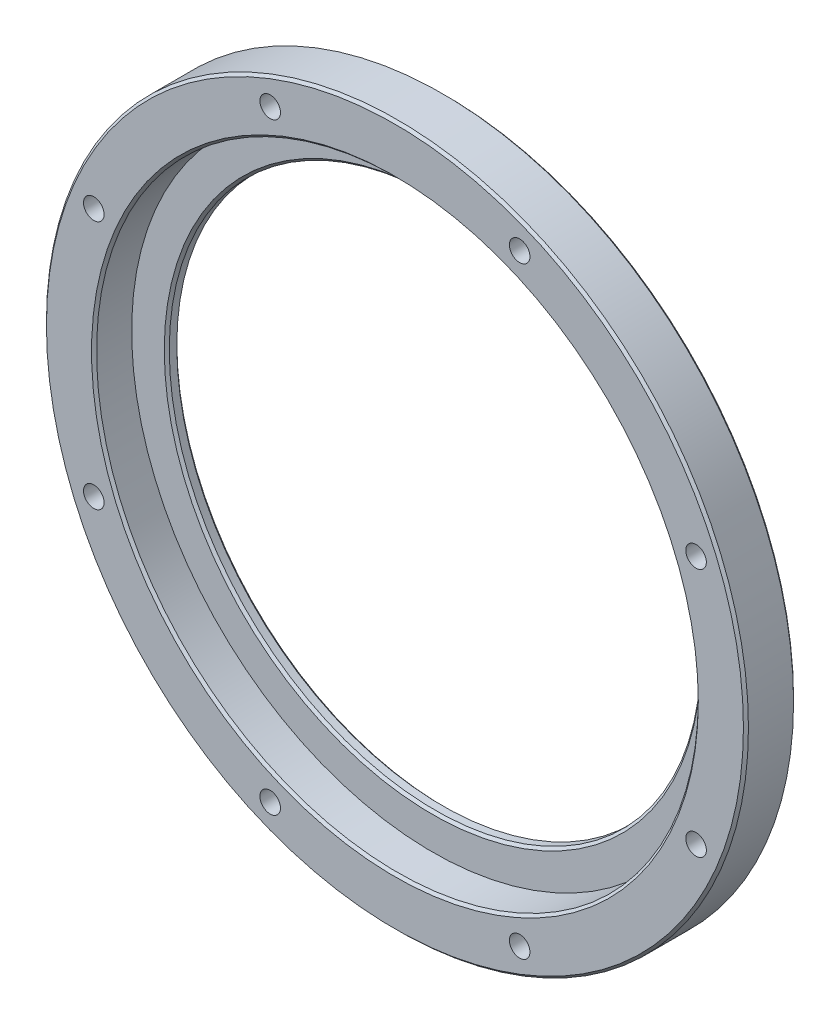
ISO-10303-21;
HEADER;
FILE_DESCRIPTION(('STEP AP214'),'2;1');
FILE_NAME('part.step','',(''),(''),'','','');
FILE_SCHEMA(('AUTOMOTIVE_DESIGN { 1 0 10303 214 1 1 1 1 }'));
ENDSEC;
DATA;
#1=APPLICATION_CONTEXT('core data for automotive mechanical design processes');
#2=APPLICATION_PROTOCOL_DEFINITION('international standard','automotive_design',2000,#1);
#3=PRODUCT_CONTEXT('',#1,'mechanical');
#4=PRODUCT('Part','Part','',(#3));
#5=PRODUCT_RELATED_PRODUCT_CATEGORY('part','',(#4));
#6=PRODUCT_DEFINITION_FORMATION('','',#4);
#7=PRODUCT_DEFINITION_CONTEXT('part definition',#1,'design');
#8=PRODUCT_DEFINITION('design','',#6,#7);
#9=PRODUCT_DEFINITION_SHAPE('','',#8);
#10=(LENGTH_UNIT() NAMED_UNIT(*) SI_UNIT(.MILLI.,.METRE.));
#11=(NAMED_UNIT(*) PLANE_ANGLE_UNIT() SI_UNIT($,.RADIAN.));
#12=(NAMED_UNIT(*) SI_UNIT($,.STERADIAN.) SOLID_ANGLE_UNIT());
#13=UNCERTAINTY_MEASURE_WITH_UNIT(LENGTH_MEASURE(1.E-05),#10,'distance_accuracy_value','');
#14=(GEOMETRIC_REPRESENTATION_CONTEXT(3) GLOBAL_UNCERTAINTY_ASSIGNED_CONTEXT((#13)) GLOBAL_UNIT_ASSIGNED_CONTEXT((#10,
#11,#12)) REPRESENTATION_CONTEXT('',''));
#15=CARTESIAN_POINT('',(0.,0.,0.));
#16=DIRECTION('',(0.,0.,1.));
#17=DIRECTION('',(1.,0.,0.));
#18=AXIS2_PLACEMENT_3D('',#15,#16,#17);
#19=CARTESIAN_POINT('',(0.,0.,20.));
#20=DIRECTION('',(0.,0.,-1.));
#21=DIRECTION('',(-1.,0.,0.));
#22=AXIS2_PLACEMENT_3D('',#19,#20,#21);
#23=CYLINDRICAL_SURFACE('',#22,140.);
#24=CARTESIAN_POINT('',(0.,0.,1.));
#25=DIRECTION('',(0.,0.,-1.));
#26=DIRECTION('',(-1.,0.,0.));
#27=AXIS2_PLACEMENT_3D('',#24,#25,#26);
#28=CIRCLE('',#27,140.);
#29=CARTESIAN_POINT('',(-140.,0.,1.));
#30=VERTEX_POINT('',#29);
#31=EDGE_CURVE('E76',#30,#30,#28,.F.);
#32=ORIENTED_EDGE('',*,*,#31,.T.);
#33=EDGE_LOOP('',(#32));
#34=FACE_BOUND('',#33,.T.);
#35=CARTESIAN_POINT('',(0.,0.,19.0000000000001));
#36=DIRECTION('',(0.,0.,1.));
#37=DIRECTION('',(1.,0.,0.));
#38=AXIS2_PLACEMENT_3D('',#35,#36,#37);
#39=CIRCLE('',#38,140.);
#40=CARTESIAN_POINT('',(140.,0.,19.0000000000001));
#41=VERTEX_POINT('',#40);
#42=EDGE_CURVE('E79',#41,#41,#39,.F.);
#43=ORIENTED_EDGE('',*,*,#42,.T.);
#44=EDGE_LOOP('',(#43));
#45=FACE_BOUND('',#44,.T.);
#46=ADVANCED_FACE('F49',(#34,#45),#23,.T.);
#47=CARTESIAN_POINT('',(140.,0.,20.));
#48=DIRECTION('',(0.,0.,1.));
#49=DIRECTION('',(1.,0.,0.));
#50=AXIS2_PLACEMENT_3D('',#47,#48,#49);
#51=PLANE('',#50);
#52=CARTESIAN_POINT('',(0.,0.,20.));
#53=DIRECTION('',(0.,0.,1.));
#54=DIRECTION('',(1.,0.,0.));
#55=AXIS2_PLACEMENT_3D('',#52,#53,#54);
#56=CIRCLE('',#55,121.);
#57=CARTESIAN_POINT('',(121.,0.,20.));
#58=VERTEX_POINT('',#57);
#59=EDGE_CURVE('E10',#58,#58,#56,.F.);
#60=ORIENTED_EDGE('',*,*,#59,.T.);
#61=EDGE_LOOP('',(#60));
#62=FACE_BOUND('',#61,.T.);
#63=CARTESIAN_POINT('',(0.,0.,20.));
#64=DIRECTION('',(0.,0.,1.));
#65=DIRECTION('',(1.,0.,0.));
#66=AXIS2_PLACEMENT_3D('',#63,#64,#65);
#67=CIRCLE('',#66,139.);
#68=CARTESIAN_POINT('',(139.,0.,20.));
#69=VERTEX_POINT('',#68);
#70=EDGE_CURVE('E57',#69,#69,#67,.T.);
#71=ORIENTED_EDGE('',*,*,#70,.T.);
#72=EDGE_LOOP('',(#71));
#73=FACE_BOUND('',#72,.T.);
#74=CARTESIAN_POINT('',(49.7488462074617,120.104339226467,20.));
#75=DIRECTION('',(0.,0.,1.));
#76=DIRECTION('',(1.,0.,0.));
#77=AXIS2_PLACEMENT_3D('',#74,#75,#76);
#78=CIRCLE('',#77,4.09999999999999);
#79=CARTESIAN_POINT('',(53.8488462074617,120.104339226467,20.));
#80=VERTEX_POINT('',#79);
#81=EDGE_CURVE('E133',#80,#80,#78,.T.);
#82=ORIENTED_EDGE('',*,*,#81,.F.);
#83=EDGE_LOOP('',(#82));
#84=FACE_BOUND('',#83,.T.);
#85=CARTESIAN_POINT('',(120.104339226467,49.7488462074616,20.));
#86=DIRECTION('',(0.,0.,1.));
#87=DIRECTION('',(1.,0.,0.));
#88=AXIS2_PLACEMENT_3D('',#85,#86,#87);
#89=CIRCLE('',#88,4.09999999999999);
#90=CARTESIAN_POINT('',(124.204339226467,49.7488462074616,20.));
#91=VERTEX_POINT('',#90);
#92=EDGE_CURVE('E127',#91,#91,#89,.T.);
#93=ORIENTED_EDGE('',*,*,#92,.F.);
#94=EDGE_LOOP('',(#93));
#95=FACE_BOUND('',#94,.T.);
#96=CARTESIAN_POINT('',(120.104339226467,-49.7488462074617,20.));
#97=DIRECTION('',(0.,0.,1.));
#98=DIRECTION('',(1.,0.,0.));
#99=AXIS2_PLACEMENT_3D('',#96,#97,#98);
#100=CIRCLE('',#99,4.09999999999999);
#101=CARTESIAN_POINT('',(124.204339226467,-49.7488462074617,20.));
#102=VERTEX_POINT('',#101);
#103=EDGE_CURVE('E121',#102,#102,#100,.T.);
#104=ORIENTED_EDGE('',*,*,#103,.F.);
#105=EDGE_LOOP('',(#104));
#106=FACE_BOUND('',#105,.T.);
#107=CARTESIAN_POINT('',(49.7488462074616,-120.104339226467,20.));
#108=DIRECTION('',(0.,0.,1.));
#109=DIRECTION('',(1.,0.,0.));
#110=AXIS2_PLACEMENT_3D('',#107,#108,#109);
#111=CIRCLE('',#110,4.09999999999999);
#112=CARTESIAN_POINT('',(53.8488462074616,-120.104339226467,20.));
#113=VERTEX_POINT('',#112);
#114=EDGE_CURVE('E115',#113,#113,#111,.T.);
#115=ORIENTED_EDGE('',*,*,#114,.F.);
#116=EDGE_LOOP('',(#115));
#117=FACE_BOUND('',#116,.T.);
#118=CARTESIAN_POINT('',(-49.7488462074617,-120.104339226467,20.));
#119=DIRECTION('',(0.,0.,1.));
#120=DIRECTION('',(1.,0.,0.));
#121=AXIS2_PLACEMENT_3D('',#118,#119,#120);
#122=CIRCLE('',#121,4.09999999999999);
#123=CARTESIAN_POINT('',(-45.6488462074617,-120.104339226467,20.));
#124=VERTEX_POINT('',#123);
#125=EDGE_CURVE('E109',#124,#124,#122,.T.);
#126=ORIENTED_EDGE('',*,*,#125,.F.);
#127=EDGE_LOOP('',(#126));
#128=FACE_BOUND('',#127,.T.);
#129=CARTESIAN_POINT('',(-120.104339226467,-49.7488462074617,20.));
#130=DIRECTION('',(0.,0.,1.));
#131=DIRECTION('',(1.,0.,0.));
#132=AXIS2_PLACEMENT_3D('',#129,#130,#131);
#133=CIRCLE('',#132,4.09999999999999);
#134=CARTESIAN_POINT('',(-116.004339226467,-49.7488462074617,20.));
#135=VERTEX_POINT('',#134);
#136=EDGE_CURVE('E103',#135,#135,#133,.T.);
#137=ORIENTED_EDGE('',*,*,#136,.F.);
#138=EDGE_LOOP('',(#137));
#139=FACE_BOUND('',#138,.T.);
#140=CARTESIAN_POINT('',(-120.104339226467,49.7488462074617,20.));
#141=DIRECTION('',(0.,0.,1.));
#142=DIRECTION('',(1.,0.,0.));
#143=AXIS2_PLACEMENT_3D('',#140,#141,#142);
#144=CIRCLE('',#143,4.09999999999999);
#145=CARTESIAN_POINT('',(-116.004339226467,49.7488462074617,20.));
#146=VERTEX_POINT('',#145);
#147=EDGE_CURVE('E97',#146,#146,#144,.T.);
#148=ORIENTED_EDGE('',*,*,#147,.F.);
#149=EDGE_LOOP('',(#148));
#150=FACE_BOUND('',#149,.T.);
#151=CARTESIAN_POINT('',(-49.7488462074617,120.104339226467,20.));
#152=DIRECTION('',(0.,0.,1.));
#153=DIRECTION('',(1.,0.,0.));
#154=AXIS2_PLACEMENT_3D('',#151,#152,#153);
#155=CIRCLE('',#154,4.09999999999999);
#156=CARTESIAN_POINT('',(-45.6488462074617,120.104339226467,20.));
#157=VERTEX_POINT('',#156);
#158=EDGE_CURVE('E91',#157,#157,#155,.T.);
#159=ORIENTED_EDGE('',*,*,#158,.F.);
#160=EDGE_LOOP('',(#159));
#161=FACE_BOUND('',#160,.T.);
#162=ADVANCED_FACE('F158',(#62,#73,#84,#95,#106,#117,#128,#139,#150,#161),#51,.T.);
#163=CARTESIAN_POINT('',(0.,0.,0.));
#164=DIRECTION('',(0.,0.,-1.));
#165=DIRECTION('',(-1.,0.,0.));
#166=AXIS2_PLACEMENT_3D('',#163,#164,#165);
#167=PLANE('',#166);
#168=CARTESIAN_POINT('',(0.,0.,0.));
#169=DIRECTION('',(0.,0.,-1.));
#170=DIRECTION('',(-1.,0.,0.));
#171=AXIS2_PLACEMENT_3D('',#168,#169,#170);
#172=CIRCLE('',#171,139.);
#173=CARTESIAN_POINT('',(-139.,0.,0.));
#174=VERTEX_POINT('',#173);
#175=EDGE_CURVE('E82',#174,#174,#172,.T.);
#176=ORIENTED_EDGE('',*,*,#175,.T.);
#177=EDGE_LOOP('',(#176));
#178=FACE_BOUND('',#177,.T.);
#179=CARTESIAN_POINT('',(0.,0.,0.));
#180=DIRECTION('',(0.,0.,-1.));
#181=DIRECTION('',(-1.,0.,0.));
#182=AXIS2_PLACEMENT_3D('',#179,#180,#181);
#183=CIRCLE('',#182,107.);
#184=CARTESIAN_POINT('',(-107.,0.,0.));
#185=VERTEX_POINT('',#184);
#186=EDGE_CURVE('E85',#185,#185,#183,.F.);
#187=ORIENTED_EDGE('',*,*,#186,.T.);
#188=EDGE_LOOP('',(#187));
#189=FACE_BOUND('',#188,.T.);
#190=CARTESIAN_POINT('',(49.7488462074617,120.104339226467,0.));
#191=DIRECTION('',(0.,0.,1.));
#192=DIRECTION('',(1.,0.,0.));
#193=AXIS2_PLACEMENT_3D('',#190,#191,#192);
#194=CIRCLE('',#193,4.09999999999999);
#195=CARTESIAN_POINT('',(53.8488462074617,120.104339226467,0.));
#196=VERTEX_POINT('',#195);
#197=EDGE_CURVE('E130',#196,#196,#194,.T.);
#198=ORIENTED_EDGE('',*,*,#197,.T.);
#199=EDGE_LOOP('',(#198));
#200=FACE_BOUND('',#199,.T.);
#201=CARTESIAN_POINT('',(120.104339226467,49.7488462074616,0.));
#202=DIRECTION('',(0.,0.,1.));
#203=DIRECTION('',(1.,0.,0.));
#204=AXIS2_PLACEMENT_3D('',#201,#202,#203);
#205=CIRCLE('',#204,4.09999999999999);
#206=CARTESIAN_POINT('',(124.204339226467,49.7488462074616,0.));
#207=VERTEX_POINT('',#206);
#208=EDGE_CURVE('E124',#207,#207,#205,.T.);
#209=ORIENTED_EDGE('',*,*,#208,.T.);
#210=EDGE_LOOP('',(#209));
#211=FACE_BOUND('',#210,.T.);
#212=CARTESIAN_POINT('',(120.104339226467,-49.7488462074617,0.));
#213=DIRECTION('',(0.,0.,1.));
#214=DIRECTION('',(1.,0.,0.));
#215=AXIS2_PLACEMENT_3D('',#212,#213,#214);
#216=CIRCLE('',#215,4.09999999999999);
#217=CARTESIAN_POINT('',(124.204339226467,-49.7488462074617,0.));
#218=VERTEX_POINT('',#217);
#219=EDGE_CURVE('E118',#218,#218,#216,.T.);
#220=ORIENTED_EDGE('',*,*,#219,.T.);
#221=EDGE_LOOP('',(#220));
#222=FACE_BOUND('',#221,.T.);
#223=CARTESIAN_POINT('',(49.7488462074616,-120.104339226467,0.));
#224=DIRECTION('',(0.,0.,1.));
#225=DIRECTION('',(1.,0.,0.));
#226=AXIS2_PLACEMENT_3D('',#223,#224,#225);
#227=CIRCLE('',#226,4.09999999999999);
#228=CARTESIAN_POINT('',(53.8488462074616,-120.104339226467,0.));
#229=VERTEX_POINT('',#228);
#230=EDGE_CURVE('E112',#229,#229,#227,.T.);
#231=ORIENTED_EDGE('',*,*,#230,.T.);
#232=EDGE_LOOP('',(#231));
#233=FACE_BOUND('',#232,.T.);
#234=CARTESIAN_POINT('',(-49.7488462074617,-120.104339226467,0.));
#235=DIRECTION('',(0.,0.,1.));
#236=DIRECTION('',(1.,0.,0.));
#237=AXIS2_PLACEMENT_3D('',#234,#235,#236);
#238=CIRCLE('',#237,4.09999999999999);
#239=CARTESIAN_POINT('',(-45.6488462074617,-120.104339226467,0.));
#240=VERTEX_POINT('',#239);
#241=EDGE_CURVE('E106',#240,#240,#238,.T.);
#242=ORIENTED_EDGE('',*,*,#241,.T.);
#243=EDGE_LOOP('',(#242));
#244=FACE_BOUND('',#243,.T.);
#245=CARTESIAN_POINT('',(-120.104339226467,-49.7488462074617,0.));
#246=DIRECTION('',(0.,0.,1.));
#247=DIRECTION('',(1.,0.,0.));
#248=AXIS2_PLACEMENT_3D('',#245,#246,#247);
#249=CIRCLE('',#248,4.09999999999999);
#250=CARTESIAN_POINT('',(-116.004339226467,-49.7488462074617,0.));
#251=VERTEX_POINT('',#250);
#252=EDGE_CURVE('E100',#251,#251,#249,.T.);
#253=ORIENTED_EDGE('',*,*,#252,.T.);
#254=EDGE_LOOP('',(#253));
#255=FACE_BOUND('',#254,.T.);
#256=CARTESIAN_POINT('',(-120.104339226467,49.7488462074617,0.));
#257=DIRECTION('',(0.,0.,1.));
#258=DIRECTION('',(1.,0.,0.));
#259=AXIS2_PLACEMENT_3D('',#256,#257,#258);
#260=CIRCLE('',#259,4.09999999999999);
#261=CARTESIAN_POINT('',(-116.004339226467,49.7488462074617,0.));
#262=VERTEX_POINT('',#261);
#263=EDGE_CURVE('E94',#262,#262,#260,.T.);
#264=ORIENTED_EDGE('',*,*,#263,.T.);
#265=EDGE_LOOP('',(#264));
#266=FACE_BOUND('',#265,.T.);
#267=CARTESIAN_POINT('',(-49.7488462074617,120.104339226467,0.));
#268=DIRECTION('',(0.,0.,1.));
#269=DIRECTION('',(1.,0.,0.));
#270=AXIS2_PLACEMENT_3D('',#267,#268,#269);
#271=CIRCLE('',#270,4.09999999999999);
#272=CARTESIAN_POINT('',(-45.6488462074617,120.104339226467,0.));
#273=VERTEX_POINT('',#272);
#274=EDGE_CURVE('E88',#273,#273,#271,.T.);
#275=ORIENTED_EDGE('',*,*,#274,.T.);
#276=EDGE_LOOP('',(#275));
#277=FACE_BOUND('',#276,.T.);
#278=ADVANCED_FACE('F165',(#178,#189,#200,#211,#222,#233,#244,#255,#266,#277),#167,.T.);
#279=CARTESIAN_POINT('',(-49.7488462074617,120.104339226467,20.));
#280=DIRECTION('',(0.,0.,1.));
#281=DIRECTION('',(1.,0.,0.));
#282=AXIS2_PLACEMENT_3D('',#279,#280,#281);
#283=CYLINDRICAL_SURFACE('',#282,4.09999999999999);
#284=ORIENTED_EDGE('',*,*,#274,.F.);
#285=EDGE_LOOP('',(#284));
#286=FACE_BOUND('',#285,.T.);
#287=ORIENTED_EDGE('',*,*,#158,.T.);
#288=EDGE_LOOP('',(#287));
#289=FACE_BOUND('',#288,.T.);
#290=ADVANCED_FACE('F313',(#286,#289),#283,.F.);
#291=CARTESIAN_POINT('',(-120.104339226467,49.7488462074617,20.));
#292=DIRECTION('',(0.,0.,1.));
#293=DIRECTION('',(1.,0.,0.));
#294=AXIS2_PLACEMENT_3D('',#291,#292,#293);
#295=CYLINDRICAL_SURFACE('',#294,4.09999999999999);
#296=ORIENTED_EDGE('',*,*,#263,.F.);
#297=EDGE_LOOP('',(#296));
#298=FACE_BOUND('',#297,.T.);
#299=ORIENTED_EDGE('',*,*,#147,.T.);
#300=EDGE_LOOP('',(#299));
#301=FACE_BOUND('',#300,.T.);
#302=ADVANCED_FACE('F303',(#298,#301),#295,.F.);
#303=CARTESIAN_POINT('',(-120.104339226467,-49.7488462074617,20.));
#304=DIRECTION('',(0.,0.,1.));
#305=DIRECTION('',(1.,0.,0.));
#306=AXIS2_PLACEMENT_3D('',#303,#304,#305);
#307=CYLINDRICAL_SURFACE('',#306,4.09999999999999);
#308=ORIENTED_EDGE('',*,*,#252,.F.);
#309=EDGE_LOOP('',(#308));
#310=FACE_BOUND('',#309,.T.);
#311=ORIENTED_EDGE('',*,*,#136,.T.);
#312=EDGE_LOOP('',(#311));
#313=FACE_BOUND('',#312,.T.);
#314=ADVANCED_FACE('F293',(#310,#313),#307,.F.);
#315=CARTESIAN_POINT('',(-49.7488462074617,-120.104339226467,20.));
#316=DIRECTION('',(0.,0.,1.));
#317=DIRECTION('',(1.,0.,0.));
#318=AXIS2_PLACEMENT_3D('',#315,#316,#317);
#319=CYLINDRICAL_SURFACE('',#318,4.09999999999999);
#320=ORIENTED_EDGE('',*,*,#241,.F.);
#321=EDGE_LOOP('',(#320));
#322=FACE_BOUND('',#321,.T.);
#323=ORIENTED_EDGE('',*,*,#125,.T.);
#324=EDGE_LOOP('',(#323));
#325=FACE_BOUND('',#324,.T.);
#326=ADVANCED_FACE('F283',(#322,#325),#319,.F.);
#327=CARTESIAN_POINT('',(49.7488462074616,-120.104339226467,20.));
#328=DIRECTION('',(0.,0.,1.));
#329=DIRECTION('',(1.,0.,0.));
#330=AXIS2_PLACEMENT_3D('',#327,#328,#329);
#331=CYLINDRICAL_SURFACE('',#330,4.09999999999999);
#332=ORIENTED_EDGE('',*,*,#230,.F.);
#333=EDGE_LOOP('',(#332));
#334=FACE_BOUND('',#333,.T.);
#335=ORIENTED_EDGE('',*,*,#114,.T.);
#336=EDGE_LOOP('',(#335));
#337=FACE_BOUND('',#336,.T.);
#338=ADVANCED_FACE('F273',(#334,#337),#331,.F.);
#339=CARTESIAN_POINT('',(120.104339226467,-49.7488462074617,20.));
#340=DIRECTION('',(0.,0.,1.));
#341=DIRECTION('',(1.,0.,0.));
#342=AXIS2_PLACEMENT_3D('',#339,#340,#341);
#343=CYLINDRICAL_SURFACE('',#342,4.09999999999999);
#344=ORIENTED_EDGE('',*,*,#219,.F.);
#345=EDGE_LOOP('',(#344));
#346=FACE_BOUND('',#345,.T.);
#347=ORIENTED_EDGE('',*,*,#103,.T.);
#348=EDGE_LOOP('',(#347));
#349=FACE_BOUND('',#348,.T.);
#350=ADVANCED_FACE('F263',(#346,#349),#343,.F.);
#351=CARTESIAN_POINT('',(120.104339226467,49.7488462074616,20.));
#352=DIRECTION('',(0.,0.,1.));
#353=DIRECTION('',(1.,0.,0.));
#354=AXIS2_PLACEMENT_3D('',#351,#352,#353);
#355=CYLINDRICAL_SURFACE('',#354,4.09999999999999);
#356=ORIENTED_EDGE('',*,*,#208,.F.);
#357=EDGE_LOOP('',(#356));
#358=FACE_BOUND('',#357,.T.);
#359=ORIENTED_EDGE('',*,*,#92,.T.);
#360=EDGE_LOOP('',(#359));
#361=FACE_BOUND('',#360,.T.);
#362=ADVANCED_FACE('F253',(#358,#361),#355,.F.);
#363=CARTESIAN_POINT('',(49.7488462074617,120.104339226467,20.));
#364=DIRECTION('',(0.,0.,1.));
#365=DIRECTION('',(1.,0.,0.));
#366=AXIS2_PLACEMENT_3D('',#363,#364,#365);
#367=CYLINDRICAL_SURFACE('',#366,4.09999999999999);
#368=ORIENTED_EDGE('',*,*,#197,.F.);
#369=EDGE_LOOP('',(#368));
#370=FACE_BOUND('',#369,.T.);
#371=ORIENTED_EDGE('',*,*,#81,.T.);
#372=EDGE_LOOP('',(#371));
#373=FACE_BOUND('',#372,.T.);
#374=ADVANCED_FACE('F243',(#370,#373),#367,.F.);
#375=CARTESIAN_POINT('',(0.,0.,20.));
#376=DIRECTION('',(0.,0.,1.));
#377=DIRECTION('',(1.,0.,0.));
#378=AXIS2_PLACEMENT_3D('',#375,#376,#377);
#379=CYLINDRICAL_SURFACE('',#378,106.);
#380=CARTESIAN_POINT('',(0.,0.,1.00000000000003));
#381=DIRECTION('',(0.,0.,-1.));
#382=DIRECTION('',(-1.,0.,0.));
#383=AXIS2_PLACEMENT_3D('',#380,#381,#382);
#384=CIRCLE('',#383,106.);
#385=CARTESIAN_POINT('',(-106.,0.,1.00000000000003));
#386=VERTEX_POINT('',#385);
#387=EDGE_CURVE('E70',#386,#386,#384,.T.);
#388=ORIENTED_EDGE('',*,*,#387,.T.);
#389=EDGE_LOOP('',(#388));
#390=FACE_BOUND('',#389,.T.);
#391=CARTESIAN_POINT('',(0.,0.,4.00000000000006));
#392=DIRECTION('',(0.,0.,-1.));
#393=DIRECTION('',(-1.,0.,0.));
#394=AXIS2_PLACEMENT_3D('',#391,#392,#393);
#395=CIRCLE('',#394,106.);
#396=CARTESIAN_POINT('',(-106.,0.,4.00000000000006));
#397=VERTEX_POINT('',#396);
#398=EDGE_CURVE('E73',#397,#397,#395,.F.);
#399=ORIENTED_EDGE('',*,*,#398,.T.);
#400=EDGE_LOOP('',(#399));
#401=FACE_BOUND('',#400,.T.);
#402=ADVANCED_FACE('F154',(#390,#401),#379,.F.);
#403=CARTESIAN_POINT('',(106.,0.,5.00000000000001));
#404=DIRECTION('',(0.,0.,-1.));
#405=DIRECTION('',(-1.,0.,0.));
#406=AXIS2_PLACEMENT_3D('',#403,#404,#405);
#407=PLANE('',#406);
#408=CARTESIAN_POINT('',(0.,0.,5.00000000000001));
#409=DIRECTION('',(0.,0.,-1.));
#410=DIRECTION('',(-1.,0.,0.));
#411=AXIS2_PLACEMENT_3D('',#408,#409,#410);
#412=CIRCLE('',#411,107.);
#413=CARTESIAN_POINT('',(-107.,0.,5.00000000000001));
#414=VERTEX_POINT('',#413);
#415=EDGE_CURVE('E65',#414,#414,#412,.T.);
#416=ORIENTED_EDGE('',*,*,#415,.T.);
#417=EDGE_LOOP('',(#416));
#418=FACE_BOUND('',#417,.T.);
#419=CARTESIAN_POINT('',(0.,0.,5.00000000000001));
#420=DIRECTION('',(0.,0.,1.));
#421=DIRECTION('',(1.,0.,0.));
#422=AXIS2_PLACEMENT_3D('',#419,#420,#421);
#423=CIRCLE('',#422,120.);
#424=CARTESIAN_POINT('',(120.,0.,5.00000000000001));
#425=VERTEX_POINT('',#424);
#426=EDGE_CURVE('E136',#425,#425,#423,.T.);
#427=ORIENTED_EDGE('',*,*,#426,.T.);
#428=EDGE_LOOP('',(#427));
#429=FACE_BOUND('',#428,.T.);
#430=ADVANCED_FACE('F140',(#418,#429),#407,.F.);
#431=CARTESIAN_POINT('',(0.,0.,20.));
#432=DIRECTION('',(0.,0.,1.));
#433=DIRECTION('',(1.,0.,0.));
#434=AXIS2_PLACEMENT_3D('',#431,#432,#433);
#435=CYLINDRICAL_SURFACE('',#434,120.);
#436=CARTESIAN_POINT('',(0.,0.,19.0000000000001));
#437=DIRECTION('',(0.,0.,1.));
#438=DIRECTION('',(1.,0.,0.));
#439=AXIS2_PLACEMENT_3D('',#436,#437,#438);
#440=CIRCLE('',#439,120.);
#441=CARTESIAN_POINT('',(120.,0.,19.0000000000001));
#442=VERTEX_POINT('',#441);
#443=EDGE_CURVE('E61',#442,#442,#440,.T.);
#444=ORIENTED_EDGE('',*,*,#443,.T.);
#445=EDGE_LOOP('',(#444));
#446=FACE_BOUND('',#445,.T.);
#447=ORIENTED_EDGE('',*,*,#426,.F.);
#448=EDGE_LOOP('',(#447));
#449=FACE_BOUND('',#448,.T.);
#450=ADVANCED_FACE('F142',(#446,#449),#435,.F.);
#451=CARTESIAN_POINT('',(0.,0.,0.));
#452=DIRECTION('',(0.,0.,1.));
#453=DIRECTION('',(1.,0.,0.));
#454=AXIS2_PLACEMENT_3D('',#451,#452,#453);
#455=CONICAL_SURFACE('',#454,139.,0.785398163397476);
#456=ORIENTED_EDGE('',*,*,#31,.F.);
#457=EDGE_LOOP('',(#456));
#458=FACE_BOUND('',#457,.T.);
#459=ORIENTED_EDGE('',*,*,#175,.F.);
#460=EDGE_LOOP('',(#459));
#461=FACE_BOUND('',#460,.T.);
#462=ADVANCED_FACE('F144',(#458,#461),#455,.T.);
#463=CARTESIAN_POINT('',(0.,0.,0.));
#464=DIRECTION('',(0.,0.,-1.));
#465=DIRECTION('',(-1.,0.,0.));
#466=AXIS2_PLACEMENT_3D('',#463,#464,#465);
#467=CONICAL_SURFACE('',#466,107.,0.785398163397462);
#468=ORIENTED_EDGE('',*,*,#387,.F.);
#469=EDGE_LOOP('',(#468));
#470=FACE_BOUND('',#469,.T.);
#471=ORIENTED_EDGE('',*,*,#186,.F.);
#472=EDGE_LOOP('',(#471));
#473=FACE_BOUND('',#472,.T.);
#474=ADVANCED_FACE('F151',(#470,#473),#467,.F.);
#475=CARTESIAN_POINT('',(0.,0.,4.00000000000006));
#476=DIRECTION('',(0.,0.,1.));
#477=DIRECTION('',(1.,0.,0.));
#478=AXIS2_PLACEMENT_3D('',#475,#476,#477);
#479=CONICAL_SURFACE('',#478,106.,0.785398163397435);
#480=ORIENTED_EDGE('',*,*,#415,.F.);
#481=EDGE_LOOP('',(#480));
#482=FACE_BOUND('',#481,.T.);
#483=ORIENTED_EDGE('',*,*,#398,.F.);
#484=EDGE_LOOP('',(#483));
#485=FACE_BOUND('',#484,.T.);
#486=ADVANCED_FACE('F179',(#482,#485),#479,.F.);
#487=CARTESIAN_POINT('',(0.,0.,19.0000000000001));
#488=DIRECTION('',(0.,0.,1.));
#489=DIRECTION('',(1.,0.,0.));
#490=AXIS2_PLACEMENT_3D('',#487,#488,#489);
#491=CONICAL_SURFACE('',#490,120.,0.785398163397455);
#492=ORIENTED_EDGE('',*,*,#59,.F.);
#493=EDGE_LOOP('',(#492));
#494=FACE_BOUND('',#493,.T.);
#495=ORIENTED_EDGE('',*,*,#443,.F.);
#496=EDGE_LOOP('',(#495));
#497=FACE_BOUND('',#496,.T.);
#498=ADVANCED_FACE('F185',(#494,#497),#491,.F.);
#499=CARTESIAN_POINT('',(0.,0.,19.0000000000001));
#500=DIRECTION('',(0.,0.,-1.));
#501=DIRECTION('',(-1.,0.,0.));
#502=AXIS2_PLACEMENT_3D('',#499,#500,#501);
#503=CONICAL_SURFACE('',#502,140.,0.785398163397435);
#504=ORIENTED_EDGE('',*,*,#70,.F.);
#505=EDGE_LOOP('',(#504));
#506=FACE_BOUND('',#505,.T.);
#507=ORIENTED_EDGE('',*,*,#42,.F.);
#508=EDGE_LOOP('',(#507));
#509=FACE_BOUND('',#508,.T.);
#510=ADVANCED_FACE('F52',(#506,#509),#503,.T.);
#511=CLOSED_SHELL('',(#46,#162,#278,#290,#302,#314,#326,#338,#350,#362,#374,#402,#430,#450,#462,
#474,#486,#498,#510));
#512=MANIFOLD_SOLID_BREP('B2',#511);
#513=ADVANCED_BREP_SHAPE_REPRESENTATION('',(#18,#512),#14);
#514=SHAPE_DEFINITION_REPRESENTATION(#9,#513);
ENDSEC;
END-ISO-10303-21;
